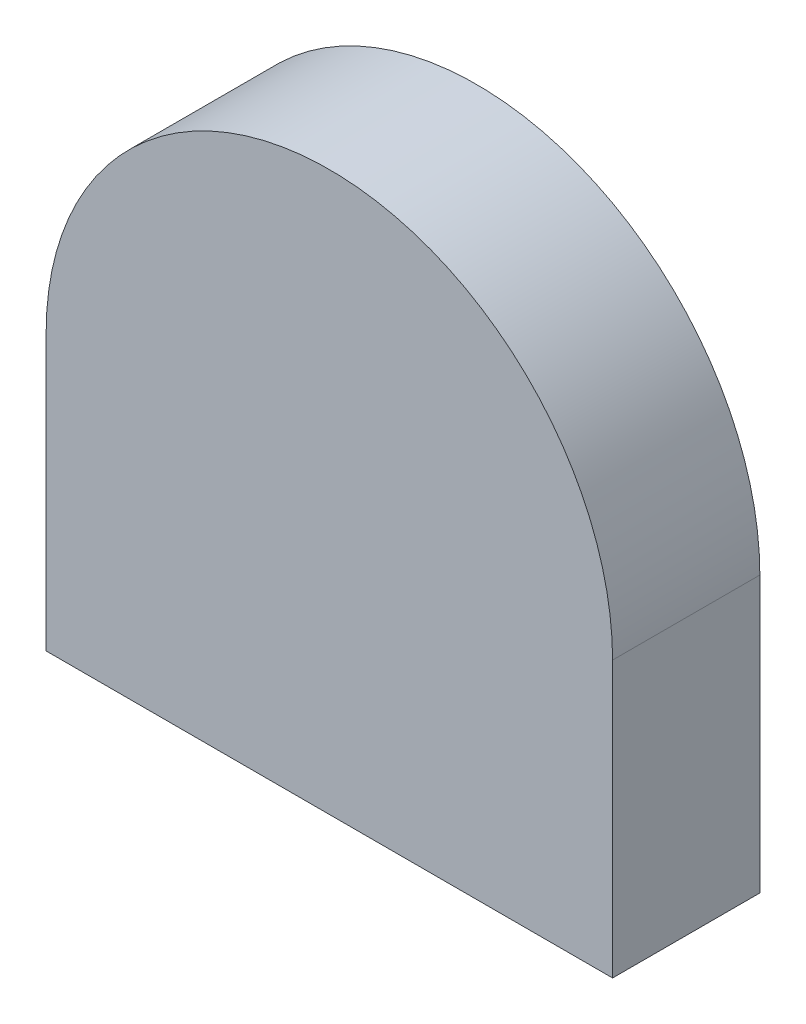
ISO-10303-21;
HEADER;
FILE_DESCRIPTION(('STEP AP214'),'2;1');
FILE_NAME('part.step','',(''),(''),'','','');
FILE_SCHEMA(('AUTOMOTIVE_DESIGN { 1 0 10303 214 1 1 1 1 }'));
ENDSEC;
DATA;
#1=APPLICATION_CONTEXT('core data for automotive mechanical design processes');
#2=APPLICATION_PROTOCOL_DEFINITION('international standard','automotive_design',2000,#1);
#3=PRODUCT_CONTEXT('',#1,'mechanical');
#4=PRODUCT('Part','Part','',(#3));
#5=PRODUCT_RELATED_PRODUCT_CATEGORY('part','',(#4));
#6=PRODUCT_DEFINITION_FORMATION('','',#4);
#7=PRODUCT_DEFINITION_CONTEXT('part definition',#1,'design');
#8=PRODUCT_DEFINITION('design','',#6,#7);
#9=PRODUCT_DEFINITION_SHAPE('','',#8);
#10=(LENGTH_UNIT() NAMED_UNIT(*) SI_UNIT(.MILLI.,.METRE.));
#11=(NAMED_UNIT(*) PLANE_ANGLE_UNIT() SI_UNIT($,.RADIAN.));
#12=(NAMED_UNIT(*) SI_UNIT($,.STERADIAN.) SOLID_ANGLE_UNIT());
#13=UNCERTAINTY_MEASURE_WITH_UNIT(LENGTH_MEASURE(1.E-05),#10,'distance_accuracy_value','');
#14=(GEOMETRIC_REPRESENTATION_CONTEXT(3) GLOBAL_UNCERTAINTY_ASSIGNED_CONTEXT((#13)) GLOBAL_UNIT_ASSIGNED_CONTEXT((#10,
#11,#12)) REPRESENTATION_CONTEXT('',''));
#15=CARTESIAN_POINT('',(0.,0.,0.));
#16=DIRECTION('',(0.,0.,1.));
#17=DIRECTION('',(1.,0.,0.));
#18=AXIS2_PLACEMENT_3D('',#15,#16,#17);
#19=CARTESIAN_POINT('',(0.,0.,13.));
#20=DIRECTION('',(0.,0.,-1.));
#21=DIRECTION('',(-1.,0.,0.));
#22=AXIS2_PLACEMENT_3D('',#19,#20,#21);
#23=CYLINDRICAL_SURFACE('',#22,14.);
#24=CARTESIAN_POINT('',(0.,0.,0.));
#25=DIRECTION('',(0.,0.,1.));
#26=DIRECTION('',(1.,0.,0.));
#27=AXIS2_PLACEMENT_3D('',#24,#25,#26);
#28=CIRCLE('',#27,14.);
#29=CARTESIAN_POINT('',(-14.,0.,0.));
#30=VERTEX_POINT('',#29);
#31=EDGE_CURVE('E106',#30,#30,#28,.T.);
#32=CARTESIAN_POINT('',(0.,0.,11.));
#33=DIRECTION('',(0.,0.,1.));
#34=DIRECTION('',(1.,0.,0.));
#35=AXIS2_PLACEMENT_3D('',#32,#33,#34);
#36=CIRCLE('',#35,14.);
#37=CARTESIAN_POINT('',(-14.,0.,11.));
#38=VERTEX_POINT('',#37);
#39=EDGE_CURVE('E99',#38,#38,#36,.T.);
#40=CARTESIAN_POINT('',(-14.,0.,0.));
#41=CARTESIAN_POINT('',(-14.,0.,0.114583333333334));
#42=CARTESIAN_POINT('',(-14.,0.,0.229166666666667));
#43=CARTESIAN_POINT('',(-14.,0.,0.458333333333334));
#44=CARTESIAN_POINT('',(-14.,0.,0.572916666666667));
#45=CARTESIAN_POINT('',(-14.,0.,0.802083333333334));
#46=CARTESIAN_POINT('',(-14.,0.,0.916666666666668));
#47=CARTESIAN_POINT('',(-14.,0.,1.14583333333333));
#48=CARTESIAN_POINT('',(-14.,0.,1.26041666666667));
#49=CARTESIAN_POINT('',(-14.,0.,1.48958333333333));
#50=CARTESIAN_POINT('',(-14.,0.,1.60416666666667));
#51=CARTESIAN_POINT('',(-14.,0.,1.83333333333333));
#52=CARTESIAN_POINT('',(-14.,0.,1.94791666666667));
#53=CARTESIAN_POINT('',(-14.,0.,2.17708333333333));
#54=CARTESIAN_POINT('',(-14.,0.,2.29166666666667));
#55=CARTESIAN_POINT('',(-14.,0.,2.52083333333333));
#56=CARTESIAN_POINT('',(-14.,0.,2.63541666666667));
#57=CARTESIAN_POINT('',(-14.,0.,2.86458333333333));
#58=CARTESIAN_POINT('',(-14.,0.,2.97916666666667));
#59=CARTESIAN_POINT('',(-14.,0.,3.20833333333333));
#60=CARTESIAN_POINT('',(-14.,0.,3.32291666666667));
#61=CARTESIAN_POINT('',(-14.,0.,3.55208333333333));
#62=CARTESIAN_POINT('',(-14.,0.,3.66666666666667));
#63=CARTESIAN_POINT('',(-14.,0.,3.89583333333333));
#64=CARTESIAN_POINT('',(-14.,0.,4.01041666666667));
#65=CARTESIAN_POINT('',(-14.,0.,4.23958333333333));
#66=CARTESIAN_POINT('',(-14.,0.,4.35416666666667));
#67=CARTESIAN_POINT('',(-14.,0.,4.58333333333333));
#68=CARTESIAN_POINT('',(-14.,0.,4.69791666666667));
#69=CARTESIAN_POINT('',(-14.,0.,4.92708333333333));
#70=CARTESIAN_POINT('',(-14.,0.,5.04166666666667));
#71=CARTESIAN_POINT('',(-14.,0.,5.27083333333333));
#72=CARTESIAN_POINT('',(-14.,0.,5.38541666666667));
#73=CARTESIAN_POINT('',(-14.,0.,5.61458333333333));
#74=CARTESIAN_POINT('',(-14.,0.,5.72916666666667));
#75=CARTESIAN_POINT('',(-14.,0.,5.95833333333333));
#76=CARTESIAN_POINT('',(-14.,0.,6.07291666666667));
#77=CARTESIAN_POINT('',(-14.,0.,6.30208333333333));
#78=CARTESIAN_POINT('',(-14.,0.,6.41666666666667));
#79=CARTESIAN_POINT('',(-14.,0.,6.64583333333333));
#80=CARTESIAN_POINT('',(-14.,0.,6.76041666666667));
#81=CARTESIAN_POINT('',(-14.,0.,6.98958333333333));
#82=CARTESIAN_POINT('',(-14.,0.,7.10416666666667));
#83=CARTESIAN_POINT('',(-14.,0.,7.33333333333333));
#84=CARTESIAN_POINT('',(-14.,0.,7.44791666666667));
#85=CARTESIAN_POINT('',(-14.,0.,7.67708333333333));
#86=CARTESIAN_POINT('',(-14.,0.,7.79166666666667));
#87=CARTESIAN_POINT('',(-14.,0.,8.02083333333333));
#88=CARTESIAN_POINT('',(-14.,0.,8.13541666666667));
#89=CARTESIAN_POINT('',(-14.,0.,8.36458333333333));
#90=CARTESIAN_POINT('',(-14.,0.,8.47916666666666));
#91=CARTESIAN_POINT('',(-14.,0.,8.70833333333333));
#92=CARTESIAN_POINT('',(-14.,0.,8.82291666666666));
#93=CARTESIAN_POINT('',(-14.,0.,9.05208333333333));
#94=CARTESIAN_POINT('',(-14.,0.,9.16666666666666));
#95=CARTESIAN_POINT('',(-14.,0.,9.39583333333333));
#96=CARTESIAN_POINT('',(-14.,0.,9.51041666666667));
#97=CARTESIAN_POINT('',(-14.,0.,9.73958333333333));
#98=CARTESIAN_POINT('',(-14.,0.,9.85416666666667));
#99=CARTESIAN_POINT('',(-14.,0.,10.0833333333333));
#100=CARTESIAN_POINT('',(-14.,0.,10.1979166666667));
#101=CARTESIAN_POINT('',(-14.,0.,10.4270833333333));
#102=CARTESIAN_POINT('',(-14.,0.,10.5416666666667));
#103=CARTESIAN_POINT('',(-14.,0.,10.7708333333333));
#104=CARTESIAN_POINT('',(-14.,0.,10.8854166666667));
#105=CARTESIAN_POINT('',(-14.,0.,11.));
#106=B_SPLINE_CURVE_WITH_KNOTS('',3,(#40,#41,#42,#43,#44,#45,#46,#47,#48,#49,#50,#51,#52,#53,
#54,#55,#56,#57,#58,#59,#60,#61,#62,#63,#64,#65,#66,#67,#68,#69,#70,#71,#72,#73,#74,#75,#76,#77,
#78,#79,#80,#81,#82,#83,#84,#85,#86,#87,#88,#89,#90,#91,#92,#93,#94,#95,#96,#97,#98,#99,#100,
#101,#102,#103,#104,#105),.UNSPECIFIED.,.F.,.F.,(4,2,2,2,2,2,2,2,2,2,2,2,2,2,2,2,2,2,2,2,2,2,2,
2,2,2,2,2,2,2,2,2,4),(0.,0.34375,0.687500000000001,1.03125,1.375,1.71875,2.0625,2.40625,2.75,
3.09375,3.4375,3.78125,4.125,4.46875,4.8125,5.15625,5.5,5.84375,6.1875,6.53125,6.875,7.21875,
7.5625,7.90625,8.25,8.59375,8.9375,9.28125,9.625,9.96875,10.3125,10.65625,11.),.UNSPECIFIED.);
#107=EDGE_CURVE('BSEAM46',#30,#38,#106,.T.);
#108=ORIENTED_EDGE('',*,*,#31,.F.);
#109=ORIENTED_EDGE('',*,*,#39,.T.);
#110=ORIENTED_EDGE('',*,*,#107,.T.);
#111=ORIENTED_EDGE('',*,*,#107,.F.);
#112=EDGE_LOOP('',(#108,#110,#109,#111));
#113=FACE_BOUND('',#112,.T.);
#114=ADVANCED_FACE('F46',(#113),#23,.F.);
#115=CARTESIAN_POINT('',(0.,0.,13.));
#116=DIRECTION('',(0.,0.,-1.));
#117=DIRECTION('',(-1.,0.,0.));
#118=AXIS2_PLACEMENT_3D('',#115,#116,#117);
#119=CYLINDRICAL_SURFACE('',#118,25.);
#120=CARTESIAN_POINT('',(0.,0.,0.));
#121=DIRECTION('',(0.,0.,1.));
#122=DIRECTION('',(1.,0.,0.));
#123=AXIS2_PLACEMENT_3D('',#120,#121,#122);
#124=CIRCLE('',#123,25.);
#125=CARTESIAN_POINT('',(-25.,0.,0.));
#126=VERTEX_POINT('',#125);
#127=CARTESIAN_POINT('',(25.,0.,0.));
#128=VERTEX_POINT('',#127);
#129=EDGE_CURVE('E83',#126,#128,#124,.F.);
#130=ORIENTED_EDGE('',*,*,#129,.F.);
#131=DIRECTION('',(0.,0.,-1.));
#132=VECTOR('',#131,1.);
#133=CARTESIAN_POINT('',(-25.,0.,13.));
#134=LINE('',#133,#132);
#135=CARTESIAN_POINT('',(-25.,0.,13.));
#136=VERTEX_POINT('',#135);
#137=EDGE_CURVE('E55',#136,#126,#134,.T.);
#138=ORIENTED_EDGE('',*,*,#137,.F.);
#139=CARTESIAN_POINT('',(0.,0.,13.));
#140=DIRECTION('',(0.,0.,1.));
#141=DIRECTION('',(1.,0.,0.));
#142=AXIS2_PLACEMENT_3D('',#139,#140,#141);
#143=CIRCLE('',#142,25.);
#144=CARTESIAN_POINT('',(25.,0.,13.));
#145=VERTEX_POINT('',#144);
#146=EDGE_CURVE('E85',#136,#145,#143,.F.);
#147=ORIENTED_EDGE('',*,*,#146,.T.);
#148=DIRECTION('',(0.,0.,-1.));
#149=VECTOR('',#148,1.);
#150=CARTESIAN_POINT('',(25.,0.,13.));
#151=LINE('',#150,#149);
#152=EDGE_CURVE('E70',#145,#128,#151,.T.);
#153=ORIENTED_EDGE('',*,*,#152,.T.);
#154=EDGE_LOOP('',(#130,#138,#147,#153));
#155=FACE_BOUND('',#154,.T.);
#156=ADVANCED_FACE('F48',(#155),#119,.T.);
#157=CARTESIAN_POINT('',(-25.,0.,13.));
#158=DIRECTION('',(1.,0.,0.));
#159=DIRECTION('',(0.,1.,0.));
#160=AXIS2_PLACEMENT_3D('',#157,#158,#159);
#161=PLANE('',#160);
#162=DIRECTION('',(0.,-1.,0.));
#163=VECTOR('',#162,1.);
#164=CARTESIAN_POINT('',(-25.,0.,0.));
#165=LINE('',#164,#163);
#166=CARTESIAN_POINT('',(-25.,-24.305372294564,0.));
#167=VERTEX_POINT('',#166);
#168=EDGE_CURVE('E97',#126,#167,#165,.T.);
#169=ORIENTED_EDGE('',*,*,#168,.T.);
#170=DIRECTION('',(0.,0.,-1.));
#171=VECTOR('',#170,1.);
#172=CARTESIAN_POINT('',(-25.,-24.305372294564,0.));
#173=LINE('',#172,#171);
#174=CARTESIAN_POINT('',(-25.,-24.305372294564,13.));
#175=VERTEX_POINT('',#174);
#176=EDGE_CURVE('E62',#175,#167,#173,.T.);
#177=ORIENTED_EDGE('',*,*,#176,.F.);
#178=DIRECTION('',(0.,-1.,0.));
#179=VECTOR('',#178,1.);
#180=CARTESIAN_POINT('',(-25.,0.,13.));
#181=LINE('',#180,#179);
#182=EDGE_CURVE('E118',#136,#175,#181,.T.);
#183=ORIENTED_EDGE('',*,*,#182,.F.);
#184=ORIENTED_EDGE('',*,*,#137,.T.);
#185=EDGE_LOOP('',(#169,#177,#183,#184));
#186=FACE_BOUND('',#185,.T.);
#187=ADVANCED_FACE('F116',(#186),#161,.F.);
#188=CARTESIAN_POINT('',(25.,0.,13.));
#189=DIRECTION('',(1.,0.,0.));
#190=DIRECTION('',(0.,1.,0.));
#191=AXIS2_PLACEMENT_3D('',#188,#189,#190);
#192=PLANE('',#191);
#193=DIRECTION('',(0.,0.,1.));
#194=VECTOR('',#193,1.);
#195=CARTESIAN_POINT('',(25.,-24.305372294564,13.));
#196=LINE('',#195,#194);
#197=CARTESIAN_POINT('',(25.,-24.305372294564,0.));
#198=VERTEX_POINT('',#197);
#199=CARTESIAN_POINT('',(25.,-24.305372294564,13.));
#200=VERTEX_POINT('',#199);
#201=EDGE_CURVE('E104',#198,#200,#196,.T.);
#202=ORIENTED_EDGE('',*,*,#201,.F.);
#203=DIRECTION('',(0.,-1.,0.));
#204=VECTOR('',#203,1.);
#205=CARTESIAN_POINT('',(25.,0.,0.));
#206=LINE('',#205,#204);
#207=EDGE_CURVE('E95',#128,#198,#206,.T.);
#208=ORIENTED_EDGE('',*,*,#207,.F.);
#209=ORIENTED_EDGE('',*,*,#152,.F.);
#210=DIRECTION('',(0.,-1.,0.));
#211=VECTOR('',#210,1.);
#212=CARTESIAN_POINT('',(25.,0.,13.));
#213=LINE('',#212,#211);
#214=EDGE_CURVE('E88',#145,#200,#213,.T.);
#215=ORIENTED_EDGE('',*,*,#214,.T.);
#216=EDGE_LOOP('',(#202,#208,#209,#215));
#217=FACE_BOUND('',#216,.T.);
#218=ADVANCED_FACE('F102',(#217),#192,.T.);
#219=CARTESIAN_POINT('',(0.,0.,13.));
#220=DIRECTION('',(0.,0.,1.));
#221=DIRECTION('',(1.,0.,0.));
#222=AXIS2_PLACEMENT_3D('',#219,#220,#221);
#223=PLANE('',#222);
#224=DIRECTION('',(-1.,0.,0.));
#225=VECTOR('',#224,1.);
#226=CARTESIAN_POINT('',(35.,-24.305372294564,13.));
#227=LINE('',#226,#225);
#228=EDGE_CURVE('E134',#200,#175,#227,.T.);
#229=ORIENTED_EDGE('',*,*,#228,.F.);
#230=ORIENTED_EDGE('',*,*,#214,.F.);
#231=ORIENTED_EDGE('',*,*,#146,.F.);
#232=ORIENTED_EDGE('',*,*,#182,.T.);
#233=EDGE_LOOP('',(#229,#230,#231,#232));
#234=FACE_BOUND('',#233,.T.);
#235=ADVANCED_FACE('F124',(#234),#223,.T.);
#236=CARTESIAN_POINT('',(0.,0.,0.));
#237=DIRECTION('',(0.,0.,1.));
#238=DIRECTION('',(1.,0.,0.));
#239=AXIS2_PLACEMENT_3D('',#236,#237,#238);
#240=PLANE('',#239);
#241=ORIENTED_EDGE('',*,*,#207,.T.);
#242=DIRECTION('',(-1.,0.,0.));
#243=VECTOR('',#242,1.);
#244=CARTESIAN_POINT('',(0.,-24.305372294564,0.));
#245=LINE('',#244,#243);
#246=EDGE_CURVE('E11',#198,#167,#245,.T.);
#247=ORIENTED_EDGE('',*,*,#246,.T.);
#248=ORIENTED_EDGE('',*,*,#168,.F.);
#249=ORIENTED_EDGE('',*,*,#129,.T.);
#250=EDGE_LOOP('',(#241,#247,#248,#249));
#251=FACE_BOUND('',#250,.T.);
#252=ORIENTED_EDGE('',*,*,#31,.T.);
#253=EDGE_LOOP('',(#252));
#254=FACE_BOUND('',#253,.T.);
#255=ADVANCED_FACE('F93',(#251,#254),#240,.F.);
#256=CARTESIAN_POINT('',(0.,0.,11.));
#257=DIRECTION('',(0.,0.,1.));
#258=DIRECTION('',(1.,0.,0.));
#259=AXIS2_PLACEMENT_3D('',#256,#257,#258);
#260=PLANE('',#259);
#261=ORIENTED_EDGE('',*,*,#39,.F.);
#262=EDGE_LOOP('',(#261));
#263=FACE_BOUND('',#262,.T.);
#264=ADVANCED_FACE('F146',(#263),#260,.F.);
#265=CARTESIAN_POINT('',(35.,-24.305372294564,0.));
#266=DIRECTION('',(0.,1.,0.));
#267=DIRECTION('',(-1.,0.,0.));
#268=AXIS2_PLACEMENT_3D('',#265,#266,#267);
#269=PLANE('',#268);
#270=ORIENTED_EDGE('',*,*,#201,.T.);
#271=ORIENTED_EDGE('',*,*,#228,.T.);
#272=ORIENTED_EDGE('',*,*,#176,.T.);
#273=ORIENTED_EDGE('',*,*,#246,.F.);
#274=EDGE_LOOP('',(#270,#271,#272,#273));
#275=FACE_BOUND('',#274,.T.);
#276=ADVANCED_FACE('F135',(#275),#269,.F.);
#277=CLOSED_SHELL('',(#114,#156,#187,#218,#235,#255,#264,#276));
#278=MANIFOLD_SOLID_BREP('B2',#277);
#279=ADVANCED_BREP_SHAPE_REPRESENTATION('',(#18,#278),#14);
#280=SHAPE_DEFINITION_REPRESENTATION(#9,#279);
ENDSEC;
END-ISO-10303-21;
